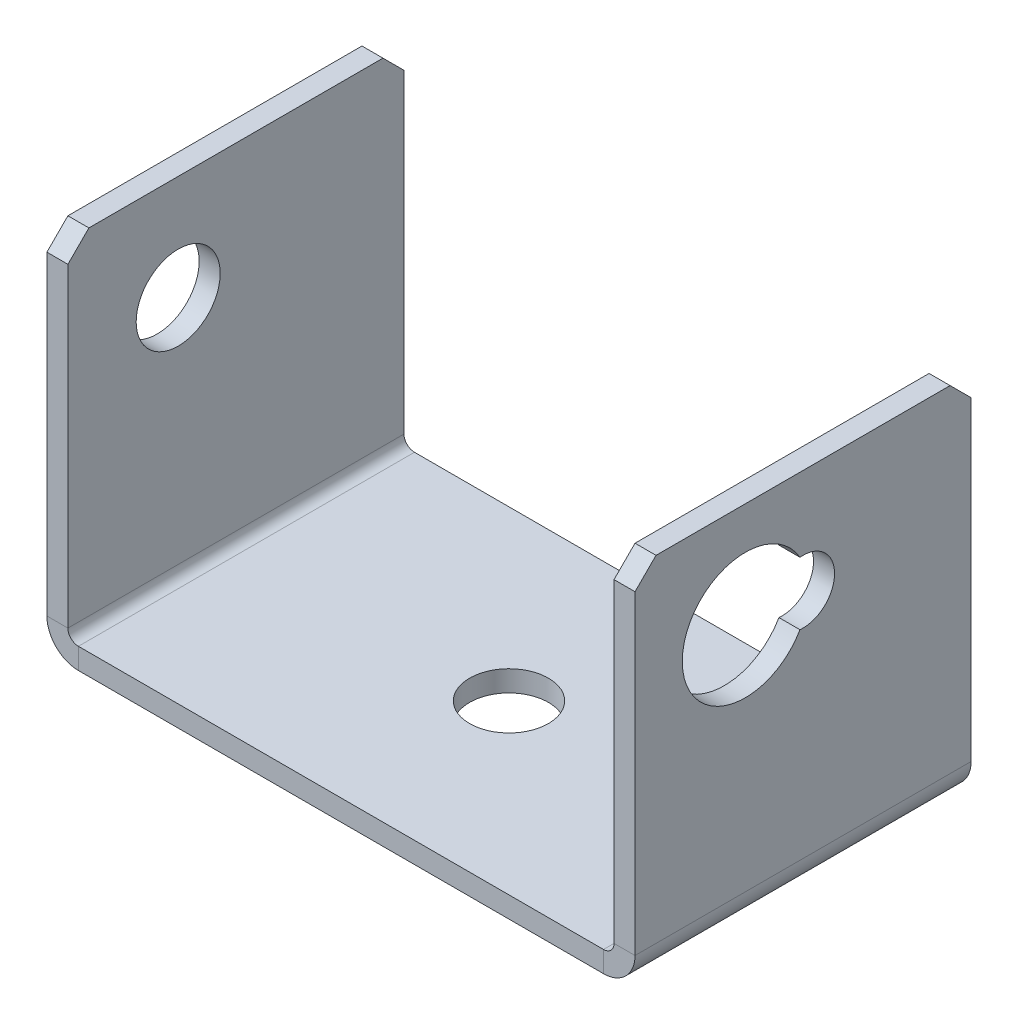
ISO-10303-21;
HEADER;
FILE_DESCRIPTION(('STEP AP214'),'2;1');
FILE_NAME('part.step','',(''),(''),'','','');
FILE_SCHEMA(('AUTOMOTIVE_DESIGN { 1 0 10303 214 1 1 1 1 }'));
ENDSEC;
DATA;
#1=APPLICATION_CONTEXT('core data for automotive mechanical design processes');
#2=APPLICATION_PROTOCOL_DEFINITION('international standard','automotive_design',2000,#1);
#3=PRODUCT_CONTEXT('',#1,'mechanical');
#4=PRODUCT('Part','Part','',(#3));
#5=PRODUCT_RELATED_PRODUCT_CATEGORY('part','',(#4));
#6=PRODUCT_DEFINITION_FORMATION('','',#4);
#7=PRODUCT_DEFINITION_CONTEXT('part definition',#1,'design');
#8=PRODUCT_DEFINITION('design','',#6,#7);
#9=PRODUCT_DEFINITION_SHAPE('','',#8);
#10=(LENGTH_UNIT() NAMED_UNIT(*) SI_UNIT(.MILLI.,.METRE.));
#11=(NAMED_UNIT(*) PLANE_ANGLE_UNIT() SI_UNIT($,.RADIAN.));
#12=(NAMED_UNIT(*) SI_UNIT($,.STERADIAN.) SOLID_ANGLE_UNIT());
#13=UNCERTAINTY_MEASURE_WITH_UNIT(LENGTH_MEASURE(1.E-05),#10,'distance_accuracy_value','');
#14=(GEOMETRIC_REPRESENTATION_CONTEXT(3) GLOBAL_UNCERTAINTY_ASSIGNED_CONTEXT((#13)) GLOBAL_UNIT_ASSIGNED_CONTEXT((#10,
#11,#12)) REPRESENTATION_CONTEXT('',''));
#15=CARTESIAN_POINT('',(0.,0.,0.));
#16=DIRECTION('',(0.,0.,1.));
#17=DIRECTION('',(1.,0.,0.));
#18=AXIS2_PLACEMENT_3D('',#15,#16,#17);
#19=CARTESIAN_POINT('',(0.,3.,32.));
#20=DIRECTION('',(0.,0.,1.));
#21=DIRECTION('',(1.,0.,0.));
#22=AXIS2_PLACEMENT_3D('',#19,#20,#21);
#23=PLANE('',#22);
#24=DIRECTION('',(1.,0.,0.));
#25=VECTOR('',#24,1.);
#26=CARTESIAN_POINT('',(0.,3.,32.));
#27=LINE('',#26,#25);
#28=CARTESIAN_POINT('',(0.,3.,32.));
#29=VERTEX_POINT('',#28);
#30=CARTESIAN_POINT('',(2.,3.,32.));
#31=VERTEX_POINT('',#30);
#32=EDGE_CURVE('E306',#29,#31,#27,.T.);
#33=ORIENTED_EDGE('',*,*,#32,.F.);
#34=CARTESIAN_POINT('',(3.,3.,32.));
#35=DIRECTION('',(0.,0.,-1.));
#36=DIRECTION('',(-1.,0.,0.));
#37=AXIS2_PLACEMENT_3D('',#34,#35,#36);
#38=CIRCLE('',#37,3.);
#39=CARTESIAN_POINT('',(3.,0.,32.));
#40=VERTEX_POINT('',#39);
#41=EDGE_CURVE('E222',#29,#40,#38,.F.);
#42=ORIENTED_EDGE('',*,*,#41,.T.);
#43=DIRECTION('',(0.,-1.,0.));
#44=VECTOR('',#43,1.);
#45=CARTESIAN_POINT('',(3.,2.,32.));
#46=LINE('',#45,#44);
#47=CARTESIAN_POINT('',(3.,2.,32.));
#48=VERTEX_POINT('',#47);
#49=EDGE_CURVE('E304',#48,#40,#46,.T.);
#50=ORIENTED_EDGE('',*,*,#49,.F.);
#51=CARTESIAN_POINT('',(3.,3.,32.));
#52=DIRECTION('',(0.,0.,1.));
#53=DIRECTION('',(1.,0.,0.));
#54=AXIS2_PLACEMENT_3D('',#51,#52,#53);
#55=CIRCLE('',#54,1.);
#56=EDGE_CURVE('E215',#31,#48,#55,.T.);
#57=ORIENTED_EDGE('',*,*,#56,.F.);
#58=EDGE_LOOP('',(#33,#42,#50,#57));
#59=FACE_BOUND('',#58,.T.);
#60=ADVANCED_FACE('F47',(#59),#23,.T.);
#61=CARTESIAN_POINT('',(3.,2.,32.));
#62=DIRECTION('',(0.,0.,1.));
#63=DIRECTION('',(1.,0.,0.));
#64=AXIS2_PLACEMENT_3D('',#61,#62,#63);
#65=PLANE('',#64);
#66=DIRECTION('',(0.,1.,0.));
#67=VECTOR('',#66,1.);
#68=CARTESIAN_POINT('',(2.,0.,32.));
#69=LINE('',#68,#67);
#70=CARTESIAN_POINT('',(2.,33.,32.));
#71=VERTEX_POINT('',#70);
#72=EDGE_CURVE('E218',#71,#31,#69,.F.);
#73=ORIENTED_EDGE('',*,*,#72,.F.);
#74=DIRECTION('',(-1.,0.,0.));
#75=VECTOR('',#74,1.);
#76=CARTESIAN_POINT('',(3.,33.,32.));
#77=LINE('',#76,#75);
#78=CARTESIAN_POINT('',(0.,33.,32.));
#79=VERTEX_POINT('',#78);
#80=EDGE_CURVE('E11',#71,#79,#77,.T.);
#81=ORIENTED_EDGE('',*,*,#80,.T.);
#82=DIRECTION('',(0.,-1.,0.));
#83=VECTOR('',#82,1.);
#84=CARTESIAN_POINT('',(0.,0.,32.));
#85=LINE('',#84,#83);
#86=EDGE_CURVE('E220',#79,#29,#85,.T.);
#87=ORIENTED_EDGE('',*,*,#86,.T.);
#88=ORIENTED_EDGE('',*,*,#32,.T.);
#89=EDGE_LOOP('',(#73,#81,#87,#88));
#90=FACE_BOUND('',#89,.T.);
#91=ADVANCED_FACE('F365',(#90),#65,.T.);
#92=CARTESIAN_POINT('',(3.,0.,0.));
#93=DIRECTION('',(0.,0.,-1.));
#94=DIRECTION('',(-1.,0.,0.));
#95=AXIS2_PLACEMENT_3D('',#92,#93,#94);
#96=PLANE('',#95);
#97=DIRECTION('',(0.,1.,0.));
#98=VECTOR('',#97,1.);
#99=CARTESIAN_POINT('',(3.,0.,0.));
#100=LINE('',#99,#98);
#101=CARTESIAN_POINT('',(3.,0.,0.));
#102=VERTEX_POINT('',#101);
#103=CARTESIAN_POINT('',(3.,2.,0.));
#104=VERTEX_POINT('',#103);
#105=EDGE_CURVE('E302',#102,#104,#100,.T.);
#106=ORIENTED_EDGE('',*,*,#105,.F.);
#107=CARTESIAN_POINT('',(3.,3.,0.));
#108=DIRECTION('',(0.,0.,-1.));
#109=DIRECTION('',(-1.,0.,0.));
#110=AXIS2_PLACEMENT_3D('',#107,#108,#109);
#111=CIRCLE('',#110,3.);
#112=CARTESIAN_POINT('',(0.,3.,0.));
#113=VERTEX_POINT('',#112);
#114=EDGE_CURVE('E250',#113,#102,#111,.F.);
#115=ORIENTED_EDGE('',*,*,#114,.F.);
#116=DIRECTION('',(-1.,0.,0.));
#117=VECTOR('',#116,1.);
#118=CARTESIAN_POINT('',(2.,3.,0.));
#119=LINE('',#118,#117);
#120=CARTESIAN_POINT('',(2.,3.,0.));
#121=VERTEX_POINT('',#120);
#122=EDGE_CURVE('E299',#121,#113,#119,.T.);
#123=ORIENTED_EDGE('',*,*,#122,.F.);
#124=CARTESIAN_POINT('',(3.,3.,0.));
#125=DIRECTION('',(0.,0.,1.));
#126=DIRECTION('',(1.,0.,0.));
#127=AXIS2_PLACEMENT_3D('',#124,#125,#126);
#128=CIRCLE('',#127,1.);
#129=EDGE_CURVE('E243',#121,#104,#128,.T.);
#130=ORIENTED_EDGE('',*,*,#129,.T.);
#131=EDGE_LOOP('',(#106,#115,#123,#130));
#132=FACE_BOUND('',#131,.T.);
#133=ADVANCED_FACE('F437',(#132),#96,.T.);
#134=CARTESIAN_POINT('',(2.,3.,0.));
#135=DIRECTION('',(0.,0.,-1.));
#136=DIRECTION('',(-1.,0.,0.));
#137=AXIS2_PLACEMENT_3D('',#134,#135,#136);
#138=PLANE('',#137);
#139=DIRECTION('',(1.,0.,0.));
#140=VECTOR('',#139,1.);
#141=CARTESIAN_POINT('',(0.,0.,0.));
#142=LINE('',#141,#140);
#143=CARTESIAN_POINT('',(53.,0.,0.));
#144=VERTEX_POINT('',#143);
#145=EDGE_CURVE('E253',#102,#144,#142,.T.);
#146=ORIENTED_EDGE('',*,*,#145,.F.);
#147=ORIENTED_EDGE('',*,*,#105,.T.);
#148=DIRECTION('',(1.,0.,0.));
#149=VECTOR('',#148,1.);
#150=CARTESIAN_POINT('',(0.,2.,0.));
#151=LINE('',#150,#149);
#152=CARTESIAN_POINT('',(53.,2.,0.));
#153=VERTEX_POINT('',#152);
#154=EDGE_CURVE('E240',#104,#153,#151,.T.);
#155=ORIENTED_EDGE('',*,*,#154,.T.);
#156=DIRECTION('',(0.,-1.,0.));
#157=VECTOR('',#156,1.);
#158=CARTESIAN_POINT('',(53.,2.,0.));
#159=LINE('',#158,#157);
#160=EDGE_CURVE('E291',#153,#144,#159,.T.);
#161=ORIENTED_EDGE('',*,*,#160,.T.);
#162=EDGE_LOOP('',(#146,#147,#155,#161));
#163=FACE_BOUND('',#162,.T.);
#164=ADVANCED_FACE('F678',(#163),#138,.T.);
#165=CARTESIAN_POINT('',(53.,0.,32.));
#166=DIRECTION('',(0.,0.,1.));
#167=DIRECTION('',(1.,0.,0.));
#168=AXIS2_PLACEMENT_3D('',#165,#166,#167);
#169=PLANE('',#168);
#170=DIRECTION('',(0.,1.,0.));
#171=VECTOR('',#170,1.);
#172=CARTESIAN_POINT('',(53.,0.,32.));
#173=LINE('',#172,#171);
#174=CARTESIAN_POINT('',(53.,0.,32.));
#175=VERTEX_POINT('',#174);
#176=CARTESIAN_POINT('',(53.,2.,32.));
#177=VERTEX_POINT('',#176);
#178=EDGE_CURVE('E297',#175,#177,#173,.T.);
#179=ORIENTED_EDGE('',*,*,#178,.F.);
#180=CARTESIAN_POINT('',(53.,3.,32.));
#181=DIRECTION('',(0.,0.,-1.));
#182=DIRECTION('',(-1.,0.,0.));
#183=AXIS2_PLACEMENT_3D('',#180,#181,#182);
#184=CIRCLE('',#183,3.);
#185=CARTESIAN_POINT('',(56.,3.,32.));
#186=VERTEX_POINT('',#185);
#187=EDGE_CURVE('E228',#175,#186,#184,.F.);
#188=ORIENTED_EDGE('',*,*,#187,.T.);
#189=DIRECTION('',(1.,0.,0.));
#190=VECTOR('',#189,1.);
#191=CARTESIAN_POINT('',(54.,3.,32.));
#192=LINE('',#191,#190);
#193=CARTESIAN_POINT('',(54.,3.,32.));
#194=VERTEX_POINT('',#193);
#195=EDGE_CURVE('E295',#194,#186,#192,.T.);
#196=ORIENTED_EDGE('',*,*,#195,.F.);
#197=CARTESIAN_POINT('',(53.,3.,32.));
#198=DIRECTION('',(0.,0.,1.));
#199=DIRECTION('',(1.,0.,0.));
#200=AXIS2_PLACEMENT_3D('',#197,#198,#199);
#201=CIRCLE('',#200,1.);
#202=EDGE_CURVE('E209',#177,#194,#201,.T.);
#203=ORIENTED_EDGE('',*,*,#202,.F.);
#204=EDGE_LOOP('',(#179,#188,#196,#203));
#205=FACE_BOUND('',#204,.T.);
#206=ADVANCED_FACE('F390',(#205),#169,.T.);
#207=CARTESIAN_POINT('',(54.,3.,32.));
#208=DIRECTION('',(0.,0.,1.));
#209=DIRECTION('',(1.,0.,0.));
#210=AXIS2_PLACEMENT_3D('',#207,#208,#209);
#211=PLANE('',#210);
#212=DIRECTION('',(1.,0.,0.));
#213=VECTOR('',#212,1.);
#214=CARTESIAN_POINT('',(0.,0.,32.));
#215=LINE('',#214,#213);
#216=EDGE_CURVE('E225',#40,#175,#215,.T.);
#217=ORIENTED_EDGE('',*,*,#216,.T.);
#218=ORIENTED_EDGE('',*,*,#178,.T.);
#219=DIRECTION('',(1.,0.,0.));
#220=VECTOR('',#219,1.);
#221=CARTESIAN_POINT('',(0.,2.,32.));
#222=LINE('',#221,#220);
#223=EDGE_CURVE('E212',#48,#177,#222,.T.);
#224=ORIENTED_EDGE('',*,*,#223,.F.);
#225=ORIENTED_EDGE('',*,*,#49,.T.);
#226=EDGE_LOOP('',(#217,#218,#224,#225));
#227=FACE_BOUND('',#226,.T.);
#228=ADVANCED_FACE('F381',(#227),#211,.T.);
#229=CARTESIAN_POINT('',(56.,3.,0.));
#230=DIRECTION('',(0.,0.,-1.));
#231=DIRECTION('',(-1.,0.,0.));
#232=AXIS2_PLACEMENT_3D('',#229,#230,#231);
#233=PLANE('',#232);
#234=DIRECTION('',(-1.,0.,0.));
#235=VECTOR('',#234,1.);
#236=CARTESIAN_POINT('',(56.,3.,0.));
#237=LINE('',#236,#235);
#238=CARTESIAN_POINT('',(56.,3.,0.));
#239=VERTEX_POINT('',#238);
#240=CARTESIAN_POINT('',(54.,3.,0.));
#241=VERTEX_POINT('',#240);
#242=EDGE_CURVE('E293',#239,#241,#237,.T.);
#243=ORIENTED_EDGE('',*,*,#242,.F.);
#244=CARTESIAN_POINT('',(53.,3.,0.));
#245=DIRECTION('',(0.,0.,-1.));
#246=DIRECTION('',(-1.,0.,0.));
#247=AXIS2_PLACEMENT_3D('',#244,#245,#246);
#248=CIRCLE('',#247,3.);
#249=EDGE_CURVE('E206',#144,#239,#248,.F.);
#250=ORIENTED_EDGE('',*,*,#249,.F.);
#251=ORIENTED_EDGE('',*,*,#160,.F.);
#252=CARTESIAN_POINT('',(53.,3.,0.));
#253=DIRECTION('',(0.,0.,1.));
#254=DIRECTION('',(1.,0.,0.));
#255=AXIS2_PLACEMENT_3D('',#252,#253,#254);
#256=CIRCLE('',#255,1.);
#257=EDGE_CURVE('E237',#153,#241,#256,.T.);
#258=ORIENTED_EDGE('',*,*,#257,.T.);
#259=EDGE_LOOP('',(#243,#250,#251,#258));
#260=FACE_BOUND('',#259,.T.);
#261=ADVANCED_FACE('F420',(#260),#233,.T.);
#262=CARTESIAN_POINT('',(53.,2.,0.));
#263=DIRECTION('',(0.,0.,-1.));
#264=DIRECTION('',(-1.,0.,0.));
#265=AXIS2_PLACEMENT_3D('',#262,#263,#264);
#266=PLANE('',#265);
#267=DIRECTION('',(0.,1.,0.));
#268=VECTOR('',#267,1.);
#269=CARTESIAN_POINT('',(54.,0.,0.));
#270=LINE('',#269,#268);
#271=CARTESIAN_POINT('',(54.,33.,0.));
#272=VERTEX_POINT('',#271);
#273=EDGE_CURVE('E234',#241,#272,#270,.T.);
#274=ORIENTED_EDGE('',*,*,#273,.T.);
#275=DIRECTION('',(1.,0.,0.));
#276=VECTOR('',#275,1.);
#277=CARTESIAN_POINT('',(53.,33.,0.));
#278=LINE('',#277,#276);
#279=CARTESIAN_POINT('',(56.,33.,0.));
#280=VERTEX_POINT('',#279);
#281=EDGE_CURVE('E312',#272,#280,#278,.T.);
#282=ORIENTED_EDGE('',*,*,#281,.T.);
#283=DIRECTION('',(0.,1.,0.));
#284=VECTOR('',#283,1.);
#285=CARTESIAN_POINT('',(56.,0.,0.));
#286=LINE('',#285,#284);
#287=EDGE_CURVE('E184',#239,#280,#286,.T.);
#288=ORIENTED_EDGE('',*,*,#287,.F.);
#289=ORIENTED_EDGE('',*,*,#242,.T.);
#290=EDGE_LOOP('',(#274,#282,#288,#289));
#291=FACE_BOUND('',#290,.T.);
#292=ADVANCED_FACE('F416',(#291),#266,.T.);
#293=CARTESIAN_POINT('',(56.,0.,32.));
#294=DIRECTION('',(-1.,0.,0.));
#295=DIRECTION('',(0.,0.,1.));
#296=AXIS2_PLACEMENT_3D('',#293,#294,#295);
#297=PLANE('',#296);
#298=CARTESIAN_POINT('',(56.,25.,21.5));
#299=DIRECTION('',(1.,0.,0.));
#300=DIRECTION('',(0.,0.,-1.));
#301=AXIS2_PLACEMENT_3D('',#298,#299,#300);
#302=CIRCLE('',#301,6.);
#303=CARTESIAN_POINT('',(56.,27.985415651391,16.2954545454545));
#304=VERTEX_POINT('',#303);
#305=CARTESIAN_POINT('',(56.,22.014584348609,16.2954545454545));
#306=VERTEX_POINT('',#305);
#307=EDGE_CURVE('E188',#304,#306,#302,.T.);
#308=ORIENTED_EDGE('',*,*,#307,.F.);
#309=CARTESIAN_POINT('',(56.,25.,16.));
#310=DIRECTION('',(1.,0.,0.));
#311=DIRECTION('',(0.,0.,-1.));
#312=AXIS2_PLACEMENT_3D('',#309,#310,#311);
#313=CIRCLE('',#312,3.);
#314=EDGE_CURVE('E178',#306,#304,#313,.T.);
#315=ORIENTED_EDGE('',*,*,#314,.F.);
#316=EDGE_LOOP('',(#308,#315));
#317=FACE_BOUND('',#316,.T.);
#318=ORIENTED_EDGE('',*,*,#287,.T.);
#319=DIRECTION('',(0.,-0.707106781186548,-0.707106781186548));
#320=VECTOR('',#319,1.);
#321=CARTESIAN_POINT('',(56.,33.,0.));
#322=LINE('',#321,#320);
#323=CARTESIAN_POINT('',(56.,35.,2.));
#324=VERTEX_POINT('',#323);
#325=EDGE_CURVE('E321',#280,#324,#322,.F.);
#326=ORIENTED_EDGE('',*,*,#325,.T.);
#327=DIRECTION('',(0.,0.,-1.));
#328=VECTOR('',#327,1.);
#329=CARTESIAN_POINT('',(56.,35.,32.));
#330=LINE('',#329,#328);
#331=CARTESIAN_POINT('',(56.,35.,30.));
#332=VERTEX_POINT('',#331);
#333=EDGE_CURVE('E288',#332,#324,#330,.T.);
#334=ORIENTED_EDGE('',*,*,#333,.F.);
#335=DIRECTION('',(0.,0.707106781186548,-0.707106781186548));
#336=VECTOR('',#335,1.);
#337=CARTESIAN_POINT('',(56.,35.,30.));
#338=LINE('',#337,#336);
#339=CARTESIAN_POINT('',(56.,33.,32.));
#340=VERTEX_POINT('',#339);
#341=EDGE_CURVE('E319',#332,#340,#338,.F.);
#342=ORIENTED_EDGE('',*,*,#341,.T.);
#343=DIRECTION('',(0.,1.,0.));
#344=VECTOR('',#343,1.);
#345=CARTESIAN_POINT('',(56.,0.,32.));
#346=LINE('',#345,#344);
#347=EDGE_CURVE('E202',#186,#340,#346,.T.);
#348=ORIENTED_EDGE('',*,*,#347,.F.);
#349=DIRECTION('',(0.,0.,-1.));
#350=VECTOR('',#349,1.);
#351=CARTESIAN_POINT('',(56.,3.,32.));
#352=LINE('',#351,#350);
#353=EDGE_CURVE('E231',#186,#239,#352,.T.);
#354=ORIENTED_EDGE('',*,*,#353,.T.);
#355=EDGE_LOOP('',(#318,#326,#334,#342,#348,#354));
#356=FACE_BOUND('',#355,.T.);
#357=ADVANCED_FACE('F192',(#317,#356),#297,.F.);
#358=CARTESIAN_POINT('',(54.,35.,32.));
#359=DIRECTION('',(0.,1.,0.));
#360=DIRECTION('',(0.,0.,1.));
#361=AXIS2_PLACEMENT_3D('',#358,#359,#360);
#362=PLANE('',#361);
#363=ORIENTED_EDGE('',*,*,#333,.T.);
#364=DIRECTION('',(-1.,0.,0.));
#365=VECTOR('',#364,1.);
#366=CARTESIAN_POINT('',(54.,35.,2.));
#367=LINE('',#366,#365);
#368=CARTESIAN_POINT('',(54.,35.,2.));
#369=VERTEX_POINT('',#368);
#370=EDGE_CURVE('E326',#324,#369,#367,.T.);
#371=ORIENTED_EDGE('',*,*,#370,.T.);
#372=DIRECTION('',(0.,0.,-1.));
#373=VECTOR('',#372,1.);
#374=CARTESIAN_POINT('',(54.,35.,32.));
#375=LINE('',#374,#373);
#376=CARTESIAN_POINT('',(54.,35.,30.));
#377=VERTEX_POINT('',#376);
#378=EDGE_CURVE('E285',#377,#369,#375,.T.);
#379=ORIENTED_EDGE('',*,*,#378,.F.);
#380=DIRECTION('',(1.,0.,0.));
#381=VECTOR('',#380,1.);
#382=CARTESIAN_POINT('',(54.,35.,30.));
#383=LINE('',#382,#381);
#384=EDGE_CURVE('E323',#377,#332,#383,.T.);
#385=ORIENTED_EDGE('',*,*,#384,.T.);
#386=EDGE_LOOP('',(#363,#371,#379,#385));
#387=FACE_BOUND('',#386,.T.);
#388=ADVANCED_FACE('F409',(#387),#362,.T.);
#389=CARTESIAN_POINT('',(54.,0.,32.));
#390=DIRECTION('',(-1.,0.,0.));
#391=DIRECTION('',(0.,0.,1.));
#392=AXIS2_PLACEMENT_3D('',#389,#390,#391);
#393=PLANE('',#392);
#394=CARTESIAN_POINT('',(54.,25.,16.));
#395=DIRECTION('',(-1.,0.,0.));
#396=DIRECTION('',(0.,0.,1.));
#397=AXIS2_PLACEMENT_3D('',#394,#395,#396);
#398=CIRCLE('',#397,3.);
#399=CARTESIAN_POINT('',(54.,27.985415651391,16.2954545454545));
#400=VERTEX_POINT('',#399);
#401=CARTESIAN_POINT('',(54.,22.014584348609,16.2954545454545));
#402=VERTEX_POINT('',#401);
#403=EDGE_CURVE('E181',#400,#402,#398,.T.);
#404=ORIENTED_EDGE('',*,*,#403,.F.);
#405=CARTESIAN_POINT('',(54.,25.,21.5));
#406=DIRECTION('',(-1.,0.,0.));
#407=DIRECTION('',(0.,0.,1.));
#408=AXIS2_PLACEMENT_3D('',#405,#406,#407);
#409=CIRCLE('',#408,6.);
#410=EDGE_CURVE('E309',#402,#400,#409,.T.);
#411=ORIENTED_EDGE('',*,*,#410,.F.);
#412=EDGE_LOOP('',(#404,#411));
#413=FACE_BOUND('',#412,.T.);
#414=ORIENTED_EDGE('',*,*,#378,.T.);
#415=DIRECTION('',(0.,0.707106781186548,0.707106781186548));
#416=VECTOR('',#415,1.);
#417=CARTESIAN_POINT('',(54.,32.5,-0.500000000000007));
#418=LINE('',#417,#416);
#419=EDGE_CURVE('E330',#369,#272,#418,.F.);
#420=ORIENTED_EDGE('',*,*,#419,.T.);
#421=ORIENTED_EDGE('',*,*,#273,.F.);
#422=DIRECTION('',(0.,0.,-1.));
#423=VECTOR('',#422,1.);
#424=CARTESIAN_POINT('',(54.,3.,32.));
#425=LINE('',#424,#423);
#426=EDGE_CURVE('E282',#194,#241,#425,.T.);
#427=ORIENTED_EDGE('',*,*,#426,.F.);
#428=DIRECTION('',(0.,1.,0.));
#429=VECTOR('',#428,1.);
#430=CARTESIAN_POINT('',(54.,0.,32.));
#431=LINE('',#430,#429);
#432=CARTESIAN_POINT('',(54.,33.,32.));
#433=VERTEX_POINT('',#432);
#434=EDGE_CURVE('E205',#194,#433,#431,.T.);
#435=ORIENTED_EDGE('',*,*,#434,.T.);
#436=DIRECTION('',(0.,-0.707106781186548,0.707106781186548));
#437=VECTOR('',#436,1.);
#438=CARTESIAN_POINT('',(54.,16.5,48.5));
#439=LINE('',#438,#437);
#440=EDGE_CURVE('E328',#433,#377,#439,.F.);
#441=ORIENTED_EDGE('',*,*,#440,.T.);
#442=EDGE_LOOP('',(#414,#420,#421,#427,#435,#441));
#443=FACE_BOUND('',#442,.T.);
#444=ADVANCED_FACE('F398',(#413,#443),#393,.T.);
#445=CARTESIAN_POINT('',(53.,3.,32.));
#446=DIRECTION('',(0.,0.,-1.));
#447=DIRECTION('',(-1.,0.,0.));
#448=AXIS2_PLACEMENT_3D('',#445,#446,#447);
#449=CYLINDRICAL_SURFACE('',#448,1.);
#450=ORIENTED_EDGE('',*,*,#257,.F.);
#451=DIRECTION('',(0.,0.,-1.));
#452=VECTOR('',#451,1.);
#453=CARTESIAN_POINT('',(53.,2.,32.));
#454=LINE('',#453,#452);
#455=EDGE_CURVE('E279',#177,#153,#454,.T.);
#456=ORIENTED_EDGE('',*,*,#455,.F.);
#457=ORIENTED_EDGE('',*,*,#202,.T.);
#458=ORIENTED_EDGE('',*,*,#426,.T.);
#459=EDGE_LOOP('',(#450,#456,#457,#458));
#460=FACE_BOUND('',#459,.T.);
#461=ADVANCED_FACE('F389',(#460),#449,.F.);
#462=CARTESIAN_POINT('',(0.,2.,32.));
#463=DIRECTION('',(0.,1.,0.));
#464=DIRECTION('',(0.,0.,1.));
#465=AXIS2_PLACEMENT_3D('',#462,#463,#464);
#466=PLANE('',#465);
#467=CARTESIAN_POINT('',(28.,2.,16.));
#468=DIRECTION('',(0.,1.,0.));
#469=DIRECTION('',(0.,0.,1.));
#470=AXIS2_PLACEMENT_3D('',#467,#468,#469);
#471=CIRCLE('',#470,3.75000000000001);
#472=CARTESIAN_POINT('',(28.,2.,19.75));
#473=VERTEX_POINT('',#472);
#474=EDGE_CURVE('E316',#473,#473,#471,.T.);
#475=ORIENTED_EDGE('',*,*,#474,.F.);
#476=EDGE_LOOP('',(#475));
#477=FACE_BOUND('',#476,.T.);
#478=ORIENTED_EDGE('',*,*,#154,.F.);
#479=DIRECTION('',(0.,0.,-1.));
#480=VECTOR('',#479,1.);
#481=CARTESIAN_POINT('',(3.,2.,32.));
#482=LINE('',#481,#480);
#483=EDGE_CURVE('E276',#48,#104,#482,.T.);
#484=ORIENTED_EDGE('',*,*,#483,.F.);
#485=ORIENTED_EDGE('',*,*,#223,.T.);
#486=ORIENTED_EDGE('',*,*,#455,.T.);
#487=EDGE_LOOP('',(#478,#484,#485,#486));
#488=FACE_BOUND('',#487,.T.);
#489=ADVANCED_FACE('F380',(#477,#488),#466,.T.);
#490=CARTESIAN_POINT('',(3.,3.,32.));
#491=DIRECTION('',(0.,0.,-1.));
#492=DIRECTION('',(-1.,0.,0.));
#493=AXIS2_PLACEMENT_3D('',#490,#491,#492);
#494=CYLINDRICAL_SURFACE('',#493,1.);
#495=ORIENTED_EDGE('',*,*,#129,.F.);
#496=DIRECTION('',(0.,0.,-1.));
#497=VECTOR('',#496,1.);
#498=CARTESIAN_POINT('',(2.,3.,32.));
#499=LINE('',#498,#497);
#500=EDGE_CURVE('E273',#31,#121,#499,.T.);
#501=ORIENTED_EDGE('',*,*,#500,.F.);
#502=ORIENTED_EDGE('',*,*,#56,.T.);
#503=ORIENTED_EDGE('',*,*,#483,.T.);
#504=EDGE_LOOP('',(#495,#501,#502,#503));
#505=FACE_BOUND('',#504,.T.);
#506=ADVANCED_FACE('F372',(#505),#494,.F.);
#507=CARTESIAN_POINT('',(2.,0.,32.));
#508=DIRECTION('',(1.,0.,0.));
#509=DIRECTION('',(0.,0.,-1.));
#510=AXIS2_PLACEMENT_3D('',#507,#508,#509);
#511=PLANE('',#510);
#512=CARTESIAN_POINT('',(2.,25.,21.5));
#513=DIRECTION('',(1.,0.,0.));
#514=DIRECTION('',(0.,0.,-1.));
#515=AXIS2_PLACEMENT_3D('',#512,#513,#514);
#516=CIRCLE('',#515,4.);
#517=CARTESIAN_POINT('',(2.,25.,17.5));
#518=VERTEX_POINT('',#517);
#519=EDGE_CURVE('E194',#518,#518,#516,.T.);
#520=ORIENTED_EDGE('',*,*,#519,.F.);
#521=EDGE_LOOP('',(#520));
#522=FACE_BOUND('',#521,.T.);
#523=DIRECTION('',(0.,1.,0.));
#524=VECTOR('',#523,1.);
#525=CARTESIAN_POINT('',(2.,0.,0.));
#526=LINE('',#525,#524);
#527=CARTESIAN_POINT('',(2.,33.,0.));
#528=VERTEX_POINT('',#527);
#529=EDGE_CURVE('E246',#528,#121,#526,.F.);
#530=ORIENTED_EDGE('',*,*,#529,.F.);
#531=DIRECTION('',(0.,0.707106781186548,0.707106781186548));
#532=VECTOR('',#531,1.);
#533=CARTESIAN_POINT('',(2.,32.5,-0.500000000000007));
#534=LINE('',#533,#532);
#535=CARTESIAN_POINT('',(2.,35.,2.));
#536=VERTEX_POINT('',#535);
#537=EDGE_CURVE('E339',#528,#536,#534,.T.);
#538=ORIENTED_EDGE('',*,*,#537,.T.);
#539=DIRECTION('',(0.,0.,-1.));
#540=VECTOR('',#539,1.);
#541=CARTESIAN_POINT('',(2.,35.,32.));
#542=LINE('',#541,#540);
#543=CARTESIAN_POINT('',(2.,35.,30.));
#544=VERTEX_POINT('',#543);
#545=EDGE_CURVE('E271',#544,#536,#542,.T.);
#546=ORIENTED_EDGE('',*,*,#545,.F.);
#547=DIRECTION('',(0.,0.707106781186548,-0.707106781186548));
#548=VECTOR('',#547,1.);
#549=CARTESIAN_POINT('',(2.,16.5,48.5));
#550=LINE('',#549,#548);
#551=EDGE_CURVE('E337',#544,#71,#550,.F.);
#552=ORIENTED_EDGE('',*,*,#551,.T.);
#553=ORIENTED_EDGE('',*,*,#72,.T.);
#554=ORIENTED_EDGE('',*,*,#500,.T.);
#555=EDGE_LOOP('',(#530,#538,#546,#552,#553,#554));
#556=FACE_BOUND('',#555,.T.);
#557=ADVANCED_FACE('F360',(#522,#556),#511,.T.);
#558=CARTESIAN_POINT('',(0.,35.,32.));
#559=DIRECTION('',(0.,1.,0.));
#560=DIRECTION('',(0.,0.,1.));
#561=AXIS2_PLACEMENT_3D('',#558,#559,#560);
#562=PLANE('',#561);
#563=ORIENTED_EDGE('',*,*,#545,.T.);
#564=DIRECTION('',(-1.,0.,0.));
#565=VECTOR('',#564,1.);
#566=CARTESIAN_POINT('',(0.,35.,2.));
#567=LINE('',#566,#565);
#568=CARTESIAN_POINT('',(0.,35.,2.));
#569=VERTEX_POINT('',#568);
#570=EDGE_CURVE('E69',#536,#569,#567,.T.);
#571=ORIENTED_EDGE('',*,*,#570,.T.);
#572=DIRECTION('',(0.,0.,-1.));
#573=VECTOR('',#572,1.);
#574=CARTESIAN_POINT('',(0.,35.,32.));
#575=LINE('',#574,#573);
#576=CARTESIAN_POINT('',(0.,35.,30.));
#577=VERTEX_POINT('',#576);
#578=EDGE_CURVE('E269',#577,#569,#575,.T.);
#579=ORIENTED_EDGE('',*,*,#578,.F.);
#580=DIRECTION('',(1.,0.,0.));
#581=VECTOR('',#580,1.);
#582=CARTESIAN_POINT('',(0.,35.,30.));
#583=LINE('',#582,#581);
#584=EDGE_CURVE('E341',#577,#544,#583,.T.);
#585=ORIENTED_EDGE('',*,*,#584,.T.);
#586=EDGE_LOOP('',(#563,#571,#579,#585));
#587=FACE_BOUND('',#586,.T.);
#588=ADVANCED_FACE('F361',(#587),#562,.T.);
#589=CARTESIAN_POINT('',(0.,0.,32.));
#590=DIRECTION('',(1.,0.,0.));
#591=DIRECTION('',(0.,0.,-1.));
#592=AXIS2_PLACEMENT_3D('',#589,#590,#591);
#593=PLANE('',#592);
#594=CARTESIAN_POINT('',(0.,25.,21.5));
#595=DIRECTION('',(-1.,0.,0.));
#596=DIRECTION('',(0.,0.,1.));
#597=AXIS2_PLACEMENT_3D('',#594,#595,#596);
#598=CIRCLE('',#597,4.);
#599=CARTESIAN_POINT('',(0.,25.,25.5));
#600=VERTEX_POINT('',#599);
#601=EDGE_CURVE('E197',#600,#600,#598,.T.);
#602=ORIENTED_EDGE('',*,*,#601,.F.);
#603=EDGE_LOOP('',(#602));
#604=FACE_BOUND('',#603,.T.);
#605=ORIENTED_EDGE('',*,*,#578,.T.);
#606=DIRECTION('',(0.,-0.707106781186548,-0.707106781186548));
#607=VECTOR('',#606,1.);
#608=CARTESIAN_POINT('',(0.,33.,0.));
#609=LINE('',#608,#607);
#610=CARTESIAN_POINT('',(0.,33.,0.));
#611=VERTEX_POINT('',#610);
#612=EDGE_CURVE('E56',#569,#611,#609,.T.);
#613=ORIENTED_EDGE('',*,*,#612,.T.);
#614=DIRECTION('',(0.,-1.,0.));
#615=VECTOR('',#614,1.);
#616=CARTESIAN_POINT('',(0.,0.,0.));
#617=LINE('',#616,#615);
#618=EDGE_CURVE('E248',#611,#113,#617,.T.);
#619=ORIENTED_EDGE('',*,*,#618,.T.);
#620=DIRECTION('',(0.,0.,-1.));
#621=VECTOR('',#620,1.);
#622=CARTESIAN_POINT('',(0.,3.,32.));
#623=LINE('',#622,#621);
#624=EDGE_CURVE('E266',#29,#113,#623,.T.);
#625=ORIENTED_EDGE('',*,*,#624,.F.);
#626=ORIENTED_EDGE('',*,*,#86,.F.);
#627=DIRECTION('',(0.,-0.707106781186548,0.707106781186548));
#628=VECTOR('',#627,1.);
#629=CARTESIAN_POINT('',(0.,35.,30.));
#630=LINE('',#629,#628);
#631=EDGE_CURVE('E345',#79,#577,#630,.F.);
#632=ORIENTED_EDGE('',*,*,#631,.T.);
#633=EDGE_LOOP('',(#605,#613,#619,#625,#626,#632));
#634=FACE_BOUND('',#633,.T.);
#635=ADVANCED_FACE('F349',(#604,#634),#593,.F.);
#636=CARTESIAN_POINT('',(3.,3.,32.));
#637=DIRECTION('',(0.,0.,-1.));
#638=DIRECTION('',(-1.,0.,0.));
#639=AXIS2_PLACEMENT_3D('',#636,#637,#638);
#640=CYLINDRICAL_SURFACE('',#639,3.);
#641=ORIENTED_EDGE('',*,*,#114,.T.);
#642=DIRECTION('',(0.,0.,-1.));
#643=VECTOR('',#642,1.);
#644=CARTESIAN_POINT('',(3.,0.,32.));
#645=LINE('',#644,#643);
#646=EDGE_CURVE('E263',#40,#102,#645,.T.);
#647=ORIENTED_EDGE('',*,*,#646,.F.);
#648=ORIENTED_EDGE('',*,*,#41,.F.);
#649=ORIENTED_EDGE('',*,*,#624,.T.);
#650=EDGE_LOOP('',(#641,#647,#648,#649));
#651=FACE_BOUND('',#650,.T.);
#652=ADVANCED_FACE('F556',(#651),#640,.T.);
#653=CARTESIAN_POINT('',(0.,0.,32.));
#654=DIRECTION('',(0.,1.,0.));
#655=DIRECTION('',(0.,0.,1.));
#656=AXIS2_PLACEMENT_3D('',#653,#654,#655);
#657=PLANE('',#656);
#658=CARTESIAN_POINT('',(28.,0.,16.));
#659=DIRECTION('',(0.,1.,0.));
#660=DIRECTION('',(0.,0.,1.));
#661=AXIS2_PLACEMENT_3D('',#658,#659,#660);
#662=CIRCLE('',#661,3.75000000000001);
#663=CARTESIAN_POINT('',(28.,0.,19.75));
#664=VERTEX_POINT('',#663);
#665=EDGE_CURVE('E313',#664,#664,#662,.T.);
#666=ORIENTED_EDGE('',*,*,#665,.T.);
#667=EDGE_LOOP('',(#666));
#668=FACE_BOUND('',#667,.T.);
#669=ORIENTED_EDGE('',*,*,#145,.T.);
#670=DIRECTION('',(0.,0.,-1.));
#671=VECTOR('',#670,1.);
#672=CARTESIAN_POINT('',(53.,0.,32.));
#673=LINE('',#672,#671);
#674=EDGE_CURVE('E260',#175,#144,#673,.T.);
#675=ORIENTED_EDGE('',*,*,#674,.F.);
#676=ORIENTED_EDGE('',*,*,#216,.F.);
#677=ORIENTED_EDGE('',*,*,#646,.T.);
#678=EDGE_LOOP('',(#669,#675,#676,#677));
#679=FACE_BOUND('',#678,.T.);
#680=ADVANCED_FACE('F546',(#668,#679),#657,.F.);
#681=CARTESIAN_POINT('',(53.,3.,32.));
#682=DIRECTION('',(0.,0.,-1.));
#683=DIRECTION('',(-1.,0.,0.));
#684=AXIS2_PLACEMENT_3D('',#681,#682,#683);
#685=CYLINDRICAL_SURFACE('',#684,3.);
#686=ORIENTED_EDGE('',*,*,#249,.T.);
#687=ORIENTED_EDGE('',*,*,#353,.F.);
#688=ORIENTED_EDGE('',*,*,#187,.F.);
#689=ORIENTED_EDGE('',*,*,#674,.T.);
#690=EDGE_LOOP('',(#686,#687,#688,#689));
#691=FACE_BOUND('',#690,.T.);
#692=ADVANCED_FACE('F422',(#691),#685,.T.);
#693=CARTESIAN_POINT('',(53.,3.,32.));
#694=DIRECTION('',(0.,0.,1.));
#695=DIRECTION('',(1.,0.,0.));
#696=AXIS2_PLACEMENT_3D('',#693,#694,#695);
#697=PLANE('',#696);
#698=ORIENTED_EDGE('',*,*,#347,.T.);
#699=DIRECTION('',(-1.,0.,0.));
#700=VECTOR('',#699,1.);
#701=CARTESIAN_POINT('',(53.,33.,32.));
#702=LINE('',#701,#700);
#703=EDGE_CURVE('E332',#340,#433,#702,.T.);
#704=ORIENTED_EDGE('',*,*,#703,.T.);
#705=ORIENTED_EDGE('',*,*,#434,.F.);
#706=ORIENTED_EDGE('',*,*,#195,.T.);
#707=EDGE_LOOP('',(#698,#704,#705,#706));
#708=FACE_BOUND('',#707,.T.);
#709=ADVANCED_FACE('F400',(#708),#697,.T.);
#710=CARTESIAN_POINT('',(53.,3.,0.));
#711=DIRECTION('',(0.,0.,1.));
#712=DIRECTION('',(1.,0.,0.));
#713=AXIS2_PLACEMENT_3D('',#710,#711,#712);
#714=PLANE('',#713);
#715=ORIENTED_EDGE('',*,*,#618,.F.);
#716=DIRECTION('',(1.,0.,0.));
#717=VECTOR('',#716,1.);
#718=CARTESIAN_POINT('',(2.,33.,0.));
#719=LINE('',#718,#717);
#720=EDGE_CURVE('E334',#611,#528,#719,.T.);
#721=ORIENTED_EDGE('',*,*,#720,.T.);
#722=ORIENTED_EDGE('',*,*,#529,.T.);
#723=ORIENTED_EDGE('',*,*,#122,.T.);
#724=EDGE_LOOP('',(#715,#721,#722,#723));
#725=FACE_BOUND('',#724,.T.);
#726=ADVANCED_FACE('F354',(#725),#714,.F.);
#727=CARTESIAN_POINT('',(46.,25.,16.));
#728=DIRECTION('',(1.,0.,0.));
#729=DIRECTION('',(0.,0.,-1.));
#730=AXIS2_PLACEMENT_3D('',#727,#728,#729);
#731=CYLINDRICAL_SURFACE('',#730,3.);
#732=ORIENTED_EDGE('',*,*,#403,.T.);
#733=DIRECTION('',(1.,0.,0.));
#734=VECTOR('',#733,1.);
#735=CARTESIAN_POINT('',(46.,22.014584348609,16.2954545454545));
#736=LINE('',#735,#734);
#737=EDGE_CURVE('E173',#402,#306,#736,.T.);
#738=ORIENTED_EDGE('',*,*,#737,.T.);
#739=ORIENTED_EDGE('',*,*,#314,.T.);
#740=DIRECTION('',(1.,0.,0.));
#741=VECTOR('',#740,1.);
#742=CARTESIAN_POINT('',(46.,27.985415651391,16.2954545454545));
#743=LINE('',#742,#741);
#744=EDGE_CURVE('E185',#400,#304,#743,.T.);
#745=ORIENTED_EDGE('',*,*,#744,.F.);
#746=EDGE_LOOP('',(#732,#738,#739,#745));
#747=FACE_BOUND('',#746,.T.);
#748=ADVANCED_FACE('F175',(#747),#731,.F.);
#749=CARTESIAN_POINT('',(46.,25.,21.5));
#750=DIRECTION('',(1.,0.,0.));
#751=DIRECTION('',(0.,0.,-1.));
#752=AXIS2_PLACEMENT_3D('',#749,#750,#751);
#753=CYLINDRICAL_SURFACE('',#752,6.);
#754=ORIENTED_EDGE('',*,*,#410,.T.);
#755=ORIENTED_EDGE('',*,*,#744,.T.);
#756=ORIENTED_EDGE('',*,*,#307,.T.);
#757=ORIENTED_EDGE('',*,*,#737,.F.);
#758=EDGE_LOOP('',(#754,#755,#756,#757));
#759=FACE_BOUND('',#758,.T.);
#760=ADVANCED_FACE('F189',(#759),#753,.F.);
#761=CARTESIAN_POINT('',(10.,25.,21.5));
#762=DIRECTION('',(-1.,0.,0.));
#763=DIRECTION('',(0.,0.,1.));
#764=AXIS2_PLACEMENT_3D('',#761,#762,#763);
#765=CYLINDRICAL_SURFACE('',#764,4.);
#766=ORIENTED_EDGE('',*,*,#519,.T.);
#767=EDGE_LOOP('',(#766));
#768=FACE_BOUND('',#767,.T.);
#769=ORIENTED_EDGE('',*,*,#601,.T.);
#770=EDGE_LOOP('',(#769));
#771=FACE_BOUND('',#770,.T.);
#772=ADVANCED_FACE('F487',(#768,#771),#765,.F.);
#773=CARTESIAN_POINT('',(28.,-8.,16.));
#774=DIRECTION('',(0.,1.,0.));
#775=DIRECTION('',(0.,0.,1.));
#776=AXIS2_PLACEMENT_3D('',#773,#774,#775);
#777=CYLINDRICAL_SURFACE('',#776,3.75000000000001);
#778=ORIENTED_EDGE('',*,*,#474,.T.);
#779=EDGE_LOOP('',(#778));
#780=FACE_BOUND('',#779,.T.);
#781=ORIENTED_EDGE('',*,*,#665,.F.);
#782=EDGE_LOOP('',(#781));
#783=FACE_BOUND('',#782,.T.);
#784=ADVANCED_FACE('F447',(#780,#783),#777,.F.);
#785=CARTESIAN_POINT('',(53.,33.,0.));
#786=DIRECTION('',(0.,-0.707106781186547,0.707106781186547));
#787=DIRECTION('',(1.,0.,0.));
#788=AXIS2_PLACEMENT_3D('',#785,#786,#787);
#789=PLANE('',#788);
#790=ORIENTED_EDGE('',*,*,#419,.F.);
#791=ORIENTED_EDGE('',*,*,#370,.F.);
#792=ORIENTED_EDGE('',*,*,#325,.F.);
#793=ORIENTED_EDGE('',*,*,#281,.F.);
#794=EDGE_LOOP('',(#790,#791,#792,#793));
#795=FACE_BOUND('',#794,.T.);
#796=ADVANCED_FACE('F413',(#795),#789,.F.);
#797=CARTESIAN_POINT('',(54.,35.,30.));
#798=DIRECTION('',(0.,-0.707106781186547,-0.707106781186547));
#799=DIRECTION('',(1.,0.,0.));
#800=AXIS2_PLACEMENT_3D('',#797,#798,#799);
#801=PLANE('',#800);
#802=ORIENTED_EDGE('',*,*,#440,.F.);
#803=ORIENTED_EDGE('',*,*,#703,.F.);
#804=ORIENTED_EDGE('',*,*,#341,.F.);
#805=ORIENTED_EDGE('',*,*,#384,.F.);
#806=EDGE_LOOP('',(#802,#803,#804,#805));
#807=FACE_BOUND('',#806,.T.);
#808=ADVANCED_FACE('F404',(#807),#801,.F.);
#809=CARTESIAN_POINT('',(53.,33.,0.));
#810=DIRECTION('',(0.,0.707106781186547,-0.707106781186547));
#811=DIRECTION('',(-1.,0.,0.));
#812=AXIS2_PLACEMENT_3D('',#809,#810,#811);
#813=PLANE('',#812);
#814=ORIENTED_EDGE('',*,*,#612,.F.);
#815=ORIENTED_EDGE('',*,*,#570,.F.);
#816=ORIENTED_EDGE('',*,*,#537,.F.);
#817=ORIENTED_EDGE('',*,*,#720,.F.);
#818=EDGE_LOOP('',(#814,#815,#816,#817));
#819=FACE_BOUND('',#818,.T.);
#820=ADVANCED_FACE('F357',(#819),#813,.T.);
#821=CARTESIAN_POINT('',(0.,35.,30.));
#822=DIRECTION('',(0.,-0.707106781186547,-0.707106781186547));
#823=DIRECTION('',(1.,0.,0.));
#824=AXIS2_PLACEMENT_3D('',#821,#822,#823);
#825=PLANE('',#824);
#826=ORIENTED_EDGE('',*,*,#631,.F.);
#827=ORIENTED_EDGE('',*,*,#80,.F.);
#828=ORIENTED_EDGE('',*,*,#551,.F.);
#829=ORIENTED_EDGE('',*,*,#584,.F.);
#830=EDGE_LOOP('',(#826,#827,#828,#829));
#831=FACE_BOUND('',#830,.T.);
#832=ADVANCED_FACE('F50',(#831),#825,.F.);
#833=CLOSED_SHELL('',(#60,#91,#133,#164,#206,#228,#261,#292,#357,#388,#444,#461,#489,#506,#557,
#588,#635,#652,#680,#692,#709,#726,#748,#760,#772,#784,#796,#808,#820,#832));
#834=MANIFOLD_SOLID_BREP('B2',#833);
#835=ADVANCED_BREP_SHAPE_REPRESENTATION('',(#18,#834),#14);
#836=SHAPE_DEFINITION_REPRESENTATION(#9,#835);
ENDSEC;
END-ISO-10303-21;
